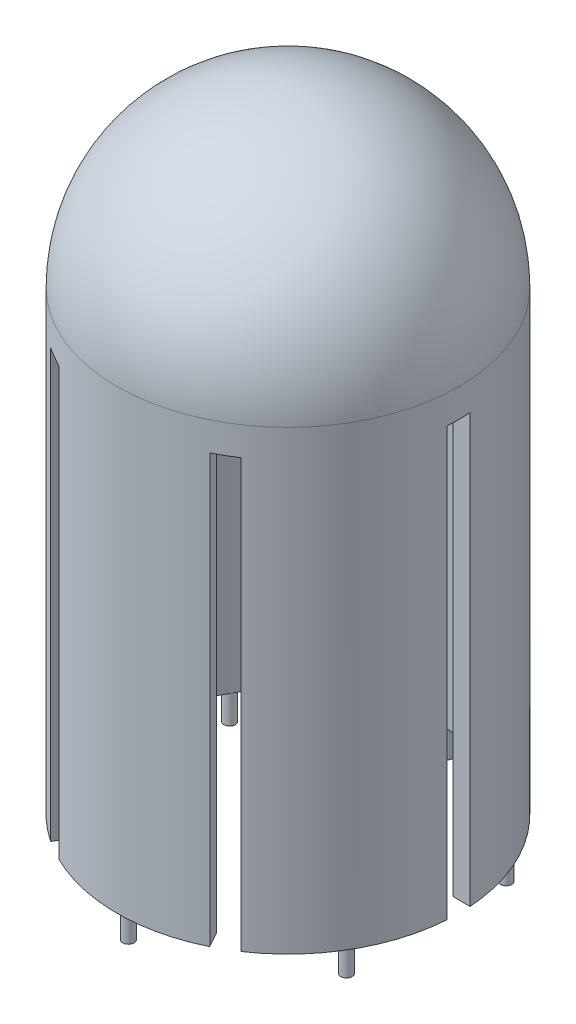
ISO-10303-21;
HEADER;
FILE_DESCRIPTION(('STEP AP214'),'2;1');
FILE_NAME('part.step','',(''),(''),'','','');
FILE_SCHEMA(('AUTOMOTIVE_DESIGN { 1 0 10303 214 1 1 1 1 }'));
ENDSEC;
DATA;
#1=APPLICATION_CONTEXT('core data for automotive mechanical design processes');
#2=APPLICATION_PROTOCOL_DEFINITION('international standard','automotive_design',2000,#1);
#3=PRODUCT_CONTEXT('',#1,'mechanical');
#4=PRODUCT('Part','Part','',(#3));
#5=PRODUCT_RELATED_PRODUCT_CATEGORY('part','',(#4));
#6=PRODUCT_DEFINITION_FORMATION('','',#4);
#7=PRODUCT_DEFINITION_CONTEXT('part definition',#1,'design');
#8=PRODUCT_DEFINITION('design','',#6,#7);
#9=PRODUCT_DEFINITION_SHAPE('','',#8);
#10=(LENGTH_UNIT() NAMED_UNIT(*) SI_UNIT(.MILLI.,.METRE.));
#11=(NAMED_UNIT(*) PLANE_ANGLE_UNIT() SI_UNIT($,.RADIAN.));
#12=(NAMED_UNIT(*) SI_UNIT($,.STERADIAN.) SOLID_ANGLE_UNIT());
#13=UNCERTAINTY_MEASURE_WITH_UNIT(LENGTH_MEASURE(1.E-05),#10,'distance_accuracy_value','');
#14=(GEOMETRIC_REPRESENTATION_CONTEXT(3) GLOBAL_UNCERTAINTY_ASSIGNED_CONTEXT((#13)) GLOBAL_UNIT_ASSIGNED_CONTEXT((#10,
#11,#12)) REPRESENTATION_CONTEXT('',''));
#15=CARTESIAN_POINT('',(0.,0.,0.));
#16=DIRECTION('',(0.,0.,1.));
#17=DIRECTION('',(1.,0.,0.));
#18=AXIS2_PLACEMENT_3D('',#15,#16,#17);
#19=CARTESIAN_POINT('',(0.,0.,0.));
#20=DIRECTION('',(0.,1.,0.));
#21=DIRECTION('',(0.,0.,1.));
#22=AXIS2_PLACEMENT_3D('',#19,#20,#21);
#23=PLANE('',#22);
#24=CARTESIAN_POINT('',(0.,0.,0.));
#25=DIRECTION('',(0.,1.,0.));
#26=DIRECTION('',(0.,0.,1.));
#27=AXIS2_PLACEMENT_3D('',#24,#25,#26);
#28=CIRCLE('',#27,38.1);
#29=CARTESIAN_POINT('',(-38.0170798767584,0.,2.51229728419531));
#30=VERTEX_POINT('',#29);
#31=CARTESIAN_POINT('',(-21.2306625511126,0.,31.6365132029557));
#32=VERTEX_POINT('',#31);
#33=EDGE_CURVE('E226',#30,#32,#28,.T.);
#34=ORIENTED_EDGE('',*,*,#33,.F.);
#35=DIRECTION('',(-0.999925339066658,0.,-0.0122195045901155));
#36=VECTOR('',#35,1.);
#37=CARTESIAN_POINT('',(-38.7268709437924,0.,2.503623341389));
#38=LINE('',#37,#36);
#39=CARTESIAN_POINT('',(-34.194379013763,0.,2.55901228272271));
#40=VERTEX_POINT('',#39);
#41=EDGE_CURVE('E213',#40,#30,#38,.T.);
#42=ORIENTED_EDGE('',*,*,#41,.F.);
#43=CARTESIAN_POINT('',(0.,0.,0.));
#44=DIRECTION('',(0.,-1.,0.));
#45=DIRECTION('',(0.,0.,-1.));
#46=AXIS2_PLACEMENT_3D('',#43,#44,#45);
#47=CIRCLE('',#46,34.29);
#48=CARTESIAN_POINT('',(-29.6960110957684,0.,17.1449999999999));
#49=VERTEX_POINT('',#48);
#50=EDGE_CURVE('E224',#49,#40,#47,.T.);
#51=ORIENTED_EDGE('',*,*,#50,.F.);
#52=CARTESIAN_POINT('',(-30.7958633585747,0.,17.7799999999999));
#53=DIRECTION('',(0.,1.,0.));
#54=DIRECTION('',(0.,0.,1.));
#55=AXIS2_PLACEMENT_3D('',#52,#53,#54);
#56=CIRCLE('',#55,1.27);
#57=EDGE_CURVE('E275',#49,#49,#56,.T.);
#58=ORIENTED_EDGE('',*,*,#57,.T.);
#59=CARTESIAN_POINT('',(-19.2821839260302,0.,28.354919908946));
#60=VERTEX_POINT('',#59);
#61=EDGE_CURVE('E233',#60,#49,#47,.T.);
#62=ORIENTED_EDGE('',*,*,#61,.F.);
#63=DIRECTION('',(0.51054507093003,0.,-0.859850993224437));
#64=VECTOR('',#63,1.);
#65=CARTESIAN_POINT('',(-21.5632771023254,0.,32.1966967567803));
#66=LINE('',#65,#64);
#67=EDGE_CURVE('E388',#32,#60,#66,.T.);
#68=ORIENTED_EDGE('',*,*,#67,.F.);
#69=EDGE_LOOP('',(#34,#42,#51,#58,#62,#68));
#70=FACE_BOUND('',#69,.T.);
#71=ADVANCED_FACE('F33',(#70),#23,.F.);
#72=CARTESIAN_POINT('',(-34.1971729264353,0.,-2.52140116591585));
#73=VERTEX_POINT('',#72);
#74=CARTESIAN_POINT('',(-29.6960110957683,0.,-17.1450000000001));
#75=VERTEX_POINT('',#74);
#76=EDGE_CURVE('E235',#73,#75,#47,.T.);
#77=ORIENTED_EDGE('',*,*,#76,.F.);
#78=DIRECTION('',(0.999925339066658,0.,0.012219504590117));
#79=VECTOR('',#78,1.);
#80=CARTESIAN_POINT('',(-38.6647958604746,0.,-2.57599738106963));
#81=LINE('',#80,#79);
#82=CARTESIAN_POINT('',(-38.0133553964775,0.,-2.56803650696334));
#83=VERTEX_POINT('',#82);
#84=EDGE_CURVE('E227',#83,#73,#81,.T.);
#85=ORIENTED_EDGE('',*,*,#84,.F.);
#86=CARTESIAN_POINT('',(-21.184253208347,0.,-31.6676083088799));
#87=VERTEX_POINT('',#86);
#88=EDGE_CURVE('E280',#87,#83,#28,.T.);
#89=ORIENTED_EDGE('',*,*,#88,.F.);
#90=DIRECTION('',(-0.489380268136629,0.,-0.872070497814552));
#91=VECTOR('',#90,1.);
#92=CARTESIAN_POINT('',(-21.5316368870428,0.,-32.2866423757138));
#93=LINE('',#92,#91);
#94=CARTESIAN_POINT('',(-19.3133591523119,0.,-28.3336947511935));
#95=VERTEX_POINT('',#94);
#96=EDGE_CURVE('E326',#95,#87,#93,.T.);
#97=ORIENTED_EDGE('',*,*,#96,.F.);
#98=EDGE_CURVE('E238',#75,#95,#47,.T.);
#99=ORIENTED_EDGE('',*,*,#98,.F.);
#100=CARTESIAN_POINT('',(-30.7958633585746,0.,-17.7800000000001));
#101=DIRECTION('',(0.,1.,0.));
#102=DIRECTION('',(0.,0.,1.));
#103=AXIS2_PLACEMENT_3D('',#100,#101,#102);
#104=CIRCLE('',#103,1.27);
#105=EDGE_CURVE('E414',#75,#75,#104,.T.);
#106=ORIENTED_EDGE('',*,*,#105,.T.);
#107=EDGE_LOOP('',(#77,#85,#89,#97,#99,#106));
#108=FACE_BOUND('',#107,.T.);
#109=ADVANCED_FACE('F440',(#108),#23,.F.);
#110=CARTESIAN_POINT('',(-14.9149890003986,0.,-30.8763210748624));
#111=VERTEX_POINT('',#110);
#112=CARTESIAN_POINT('',(2.39445790217862E-13,0.,-34.29));
#113=VERTEX_POINT('',#112);
#114=EDGE_CURVE('E241',#111,#113,#47,.T.);
#115=ORIENTED_EDGE('',*,*,#114,.F.);
#116=DIRECTION('',(0.489380268136628,0.,0.872070497814553));
#117=VECTOR('',#116,1.);
#118=CARTESIAN_POINT('',(-17.1015187581449,0.,-34.7726941378479));
#119=LINE('',#118,#117);
#120=CARTESIAN_POINT('',(-16.7826928453584,0.,-34.2045497099195));
#121=VERTEX_POINT('',#120);
#122=EDGE_CURVE('E321',#121,#111,#119,.T.);
#123=ORIENTED_EDGE('',*,*,#122,.F.);
#124=CARTESIAN_POINT('',(16.8328266684134,0.,-34.1799055930696));
#125=VERTEX_POINT('',#124);
#126=EDGE_CURVE('E287',#125,#121,#28,.T.);
#127=ORIENTED_EDGE('',*,*,#126,.F.);
#128=DIRECTION('',(0.510545070930029,0.,-0.859850993224437));
#129=VECTOR('',#128,1.);
#130=CARTESIAN_POINT('',(17.1952340567538,0.,-34.7902657171008));
#131=LINE('',#130,#129);
#132=CARTESIAN_POINT('',(14.8810198614533,0.,-30.8927070339107));
#133=VERTEX_POINT('',#132);
#134=EDGE_CURVE('E320',#133,#125,#131,.T.);
#135=ORIENTED_EDGE('',*,*,#134,.F.);
#136=EDGE_CURVE('E247',#113,#133,#47,.T.);
#137=ORIENTED_EDGE('',*,*,#136,.F.);
#138=CARTESIAN_POINT('',(2.48314152818524E-13,0.,-35.56));
#139=DIRECTION('',(0.,1.,0.));
#140=DIRECTION('',(0.,0.,1.));
#141=AXIS2_PLACEMENT_3D('',#138,#139,#140);
#142=CIRCLE('',#141,1.27);
#143=EDGE_CURVE('E408',#113,#113,#142,.T.);
#144=ORIENTED_EDGE('',*,*,#143,.T.);
#145=EDGE_LOOP('',(#115,#123,#127,#135,#137,#144));
#146=FACE_BOUND('',#145,.T.);
#147=ADVANCED_FACE('F319',(#146),#23,.F.);
#148=CARTESIAN_POINT('',(19.282183926038,0.,-28.3549199089407));
#149=VERTEX_POINT('',#148);
#150=CARTESIAN_POINT('',(29.6960110957686,0.,-17.1449999999997));
#151=VERTEX_POINT('',#150);
#152=EDGE_CURVE('E250',#149,#151,#47,.T.);
#153=ORIENTED_EDGE('',*,*,#152,.F.);
#154=DIRECTION('',(-0.51054507093003,0.,0.859850993224437));
#155=VECTOR('',#154,1.);
#156=CARTESIAN_POINT('',(21.5632771023339,0.,-32.1966967567762));
#157=LINE('',#156,#155);
#158=CARTESIAN_POINT('',(21.2306625511204,0.,-31.6365132029504));
#159=VERTEX_POINT('',#158);
#160=EDGE_CURVE('E344',#159,#149,#157,.T.);
#161=ORIENTED_EDGE('',*,*,#160,.F.);
#162=CARTESIAN_POINT('',(38.0170798767586,0.,-2.51229728419135));
#163=VERTEX_POINT('',#162);
#164=EDGE_CURVE('E298',#163,#159,#28,.T.);
#165=ORIENTED_EDGE('',*,*,#164,.F.);
#166=DIRECTION('',(0.999925339066659,0.,0.0122195045901146));
#167=VECTOR('',#166,1.);
#168=CARTESIAN_POINT('',(38.7268709438009,0.,-2.50362334138494));
#169=LINE('',#168,#167);
#170=CARTESIAN_POINT('',(34.1943790137633,0.,-2.55901228271875));
#171=VERTEX_POINT('',#170);
#172=EDGE_CURVE('E353',#171,#163,#169,.T.);
#173=ORIENTED_EDGE('',*,*,#172,.F.);
#174=EDGE_CURVE('E252',#151,#171,#47,.T.);
#175=ORIENTED_EDGE('',*,*,#174,.F.);
#176=CARTESIAN_POINT('',(30.7958633585748,0.,-17.7799999999997));
#177=DIRECTION('',(0.,1.,0.));
#178=DIRECTION('',(0.,0.,1.));
#179=AXIS2_PLACEMENT_3D('',#176,#177,#178);
#180=CIRCLE('',#179,1.27);
#181=EDGE_CURVE('E402',#151,#151,#180,.T.);
#182=ORIENTED_EDGE('',*,*,#181,.T.);
#183=EDGE_LOOP('',(#153,#161,#165,#173,#175,#182));
#184=FACE_BOUND('',#183,.T.);
#185=ADVANCED_FACE('F458',(#184),#23,.F.);
#186=CARTESIAN_POINT('',(34.197172926435,0.,2.5214011659198));
#187=VERTEX_POINT('',#186);
#188=CARTESIAN_POINT('',(29.6960110957682,0.,17.1450000000003));
#189=VERTEX_POINT('',#188);
#190=EDGE_CURVE('E255',#187,#189,#47,.T.);
#191=ORIENTED_EDGE('',*,*,#190,.F.);
#192=DIRECTION('',(-0.999925339066658,0.,-0.012219504590117));
#193=VECTOR('',#192,1.);
#194=CARTESIAN_POINT('',(38.6647958604831,0.,2.5759973810737));
#195=LINE('',#194,#193);
#196=CARTESIAN_POINT('',(38.0133553964772,0.,2.5680365069673));
#197=VERTEX_POINT('',#196);
#198=EDGE_CURVE('E358',#197,#187,#195,.T.);
#199=ORIENTED_EDGE('',*,*,#198,.F.);
#200=CARTESIAN_POINT('',(21.1842532083516,0.,31.6676083088768));
#201=VERTEX_POINT('',#200);
#202=EDGE_CURVE('E291',#201,#197,#28,.T.);
#203=ORIENTED_EDGE('',*,*,#202,.F.);
#204=DIRECTION('',(0.489380268136629,0.,0.872070497814552));
#205=VECTOR('',#204,1.);
#206=CARTESIAN_POINT('',(21.5316368870514,0.,32.2866423757179));
#207=LINE('',#206,#205);
#208=CARTESIAN_POINT('',(19.3133591523164,0.,28.3336947511904));
#209=VERTEX_POINT('',#208);
#210=EDGE_CURVE('E368',#209,#201,#207,.T.);
#211=ORIENTED_EDGE('',*,*,#210,.F.);
#212=EDGE_CURVE('E239',#189,#209,#47,.T.);
#213=ORIENTED_EDGE('',*,*,#212,.F.);
#214=CARTESIAN_POINT('',(30.7958633585744,0.,17.7800000000004));
#215=DIRECTION('',(0.,1.,0.));
#216=DIRECTION('',(0.,0.,1.));
#217=AXIS2_PLACEMENT_3D('',#214,#215,#216);
#218=CIRCLE('',#217,1.27);
#219=EDGE_CURVE('E398',#189,#189,#218,.T.);
#220=ORIENTED_EDGE('',*,*,#219,.T.);
#221=EDGE_LOOP('',(#191,#199,#203,#211,#213,#220));
#222=FACE_BOUND('',#221,.T.);
#223=ADVANCED_FACE('F450',(#222),#23,.F.);
#224=CARTESIAN_POINT('',(0.,101.6,0.));
#225=DIRECTION('',(0.,-1.,0.));
#226=DIRECTION('',(0.,0.,-1.));
#227=AXIS2_PLACEMENT_3D('',#224,#225,#226);
#228=CYLINDRICAL_SURFACE('',#227,38.1);
#229=CARTESIAN_POINT('',(0.,101.6,0.));
#230=DIRECTION('',(0.,1.,0.));
#231=DIRECTION('',(0.,0.,1.));
#232=AXIS2_PLACEMENT_3D('',#229,#230,#231);
#233=CIRCLE('',#232,38.1);
#234=CARTESIAN_POINT('',(0.,101.6,38.1));
#235=VERTEX_POINT('',#234);
#236=EDGE_CURVE('E290',#235,#235,#233,.T.);
#237=ORIENTED_EDGE('',*,*,#236,.F.);
#238=EDGE_LOOP('',(#237));
#239=FACE_BOUND('',#238,.T.);
#240=CARTESIAN_POINT('',(0.,95.25,0.));
#241=DIRECTION('',(0.,-1.,0.));
#242=DIRECTION('',(0.,0.,-1.));
#243=AXIS2_PLACEMENT_3D('',#240,#241,#242);
#244=CIRCLE('',#243,38.1);
#245=CARTESIAN_POINT('',(-38.0170798767584,95.25,2.51229728419531));
#246=VERTEX_POINT('',#245);
#247=CARTESIAN_POINT('',(-38.0133553964775,95.25,-2.56803650696334));
#248=VERTEX_POINT('',#247);
#249=EDGE_CURVE('E529',#246,#248,#244,.T.);
#250=ORIENTED_EDGE('',*,*,#249,.F.);
#251=DIRECTION('',(0.,-1.,0.));
#252=VECTOR('',#251,1.);
#253=CARTESIAN_POINT('',(-38.0170798767584,101.6,2.51229728419531));
#254=LINE('',#253,#252);
#255=EDGE_CURVE('E330',#246,#30,#254,.T.);
#256=ORIENTED_EDGE('',*,*,#255,.T.);
#257=ORIENTED_EDGE('',*,*,#33,.T.);
#258=DIRECTION('',(0.,-1.,0.));
#259=VECTOR('',#258,1.);
#260=CARTESIAN_POINT('',(-21.2306625511126,101.6,31.6365132029557));
#261=LINE('',#260,#259);
#262=CARTESIAN_POINT('',(-21.2306625511125,95.25,31.6365132029557));
#263=VERTEX_POINT('',#262);
#264=EDGE_CURVE('E394',#32,#263,#261,.F.);
#265=ORIENTED_EDGE('',*,*,#264,.T.);
#266=CARTESIAN_POINT('',(0.,95.25,0.));
#267=DIRECTION('',(0.,-1.,0.));
#268=DIRECTION('',(0.,0.,-1.));
#269=AXIS2_PLACEMENT_3D('',#266,#267,#268);
#270=CIRCLE('',#269,38.1);
#271=CARTESIAN_POINT('',(-16.8328266684049,95.25,34.1799055930738));
#272=VERTEX_POINT('',#271);
#273=EDGE_CURVE('E390',#272,#263,#270,.T.);
#274=ORIENTED_EDGE('',*,*,#273,.F.);
#275=DIRECTION('',(0.,-1.,0.));
#276=VECTOR('',#275,1.);
#277=CARTESIAN_POINT('',(-16.8328266684049,101.6,34.1799055930738));
#278=LINE('',#277,#276);
#279=CARTESIAN_POINT('',(-16.8328266684049,0.,34.1799055930738));
#280=VERTEX_POINT('',#279);
#281=EDGE_CURVE('E396',#272,#280,#278,.T.);
#282=ORIENTED_EDGE('',*,*,#281,.T.);
#283=CARTESIAN_POINT('',(16.7826928453633,0.,34.2045497099171));
#284=VERTEX_POINT('',#283);
#285=EDGE_CURVE('E282',#280,#284,#28,.T.);
#286=ORIENTED_EDGE('',*,*,#285,.T.);
#287=DIRECTION('',(0.,-1.,0.));
#288=VECTOR('',#287,1.);
#289=CARTESIAN_POINT('',(16.7826928453633,101.6,34.2045497099171));
#290=LINE('',#289,#288);
#291=CARTESIAN_POINT('',(16.7826928453633,95.25,34.2045497099171));
#292=VERTEX_POINT('',#291);
#293=EDGE_CURVE('E379',#284,#292,#290,.F.);
#294=ORIENTED_EDGE('',*,*,#293,.T.);
#295=CARTESIAN_POINT('',(0.,95.25,0.));
#296=DIRECTION('',(0.,-1.,0.));
#297=DIRECTION('',(0.,0.,-1.));
#298=AXIS2_PLACEMENT_3D('',#295,#296,#297);
#299=CIRCLE('',#298,38.1);
#300=CARTESIAN_POINT('',(21.1842532083516,95.25,31.6676083088768));
#301=VERTEX_POINT('',#300);
#302=EDGE_CURVE('E375',#301,#292,#299,.T.);
#303=ORIENTED_EDGE('',*,*,#302,.F.);
#304=DIRECTION('',(0.,-1.,0.));
#305=VECTOR('',#304,1.);
#306=CARTESIAN_POINT('',(21.1842532083516,101.6,31.6676083088768));
#307=LINE('',#306,#305);
#308=EDGE_CURVE('E381',#301,#201,#307,.T.);
#309=ORIENTED_EDGE('',*,*,#308,.T.);
#310=ORIENTED_EDGE('',*,*,#202,.T.);
#311=DIRECTION('',(0.,-1.,0.));
#312=VECTOR('',#311,1.);
#313=CARTESIAN_POINT('',(38.0133553964772,101.6,2.5680365069673));
#314=LINE('',#313,#312);
#315=CARTESIAN_POINT('',(38.0133553964772,95.25,2.5680365069673));
#316=VERTEX_POINT('',#315);
#317=EDGE_CURVE('E364',#197,#316,#314,.F.);
#318=ORIENTED_EDGE('',*,*,#317,.T.);
#319=CARTESIAN_POINT('',(0.,95.25,0.));
#320=DIRECTION('',(0.,-1.,0.));
#321=DIRECTION('',(0.,0.,-1.));
#322=AXIS2_PLACEMENT_3D('',#319,#320,#321);
#323=CIRCLE('',#322,38.1);
#324=CARTESIAN_POINT('',(38.0170798767586,95.25,-2.51229728419135));
#325=VERTEX_POINT('',#324);
#326=EDGE_CURVE('E360',#325,#316,#323,.T.);
#327=ORIENTED_EDGE('',*,*,#326,.F.);
#328=DIRECTION('',(0.,-1.,0.));
#329=VECTOR('',#328,1.);
#330=CARTESIAN_POINT('',(38.0170798767586,101.6,-2.51229728419135));
#331=LINE('',#330,#329);
#332=EDGE_CURVE('E366',#325,#163,#331,.T.);
#333=ORIENTED_EDGE('',*,*,#332,.T.);
#334=ORIENTED_EDGE('',*,*,#164,.T.);
#335=DIRECTION('',(0.,-1.,0.));
#336=VECTOR('',#335,1.);
#337=CARTESIAN_POINT('',(21.2306625511204,101.6,-31.6365132029504));
#338=LINE('',#337,#336);
#339=CARTESIAN_POINT('',(21.2306625511204,95.25,-31.6365132029504));
#340=VERTEX_POINT('',#339);
#341=EDGE_CURVE('E350',#159,#340,#338,.F.);
#342=ORIENTED_EDGE('',*,*,#341,.T.);
#343=CARTESIAN_POINT('',(0.,95.25,0.));
#344=DIRECTION('',(0.,-1.,0.));
#345=DIRECTION('',(0.,0.,-1.));
#346=AXIS2_PLACEMENT_3D('',#343,#344,#345);
#347=CIRCLE('',#346,38.1);
#348=CARTESIAN_POINT('',(16.8328266684134,95.25,-34.1799055930696));
#349=VERTEX_POINT('',#348);
#350=EDGE_CURVE('E346',#349,#340,#347,.T.);
#351=ORIENTED_EDGE('',*,*,#350,.F.);
#352=DIRECTION('',(0.,-1.,0.));
#353=VECTOR('',#352,1.);
#354=CARTESIAN_POINT('',(16.8328266684134,101.6,-34.1799055930696));
#355=LINE('',#354,#353);
#356=EDGE_CURVE('E314',#349,#125,#355,.T.);
#357=ORIENTED_EDGE('',*,*,#356,.T.);
#358=ORIENTED_EDGE('',*,*,#126,.T.);
#359=DIRECTION('',(0.,-1.,0.));
#360=VECTOR('',#359,1.);
#361=CARTESIAN_POINT('',(-16.7826928453584,101.6,-34.2045497099195));
#362=LINE('',#361,#360);
#363=CARTESIAN_POINT('',(-16.7826928453584,95.25,-34.2045497099195));
#364=VERTEX_POINT('',#363);
#365=EDGE_CURVE('E312',#121,#364,#362,.F.);
#366=ORIENTED_EDGE('',*,*,#365,.T.);
#367=CARTESIAN_POINT('',(0.,95.25,0.));
#368=DIRECTION('',(0.,-1.,0.));
#369=DIRECTION('',(0.,0.,-1.));
#370=AXIS2_PLACEMENT_3D('',#367,#368,#369);
#371=CIRCLE('',#370,38.1);
#372=CARTESIAN_POINT('',(-21.184253208347,95.25,-31.6676083088799));
#373=VERTEX_POINT('',#372);
#374=EDGE_CURVE('E334',#373,#364,#371,.T.);
#375=ORIENTED_EDGE('',*,*,#374,.F.);
#376=DIRECTION('',(0.,-1.,0.));
#377=VECTOR('',#376,1.);
#378=CARTESIAN_POINT('',(-21.184253208347,101.6,-31.6676083088799));
#379=LINE('',#378,#377);
#380=EDGE_CURVE('E337',#373,#87,#379,.T.);
#381=ORIENTED_EDGE('',*,*,#380,.T.);
#382=ORIENTED_EDGE('',*,*,#88,.T.);
#383=DIRECTION('',(0.,-1.,0.));
#384=VECTOR('',#383,1.);
#385=CARTESIAN_POINT('',(-38.0133553964775,101.6,-2.56803650696334));
#386=LINE('',#385,#384);
#387=EDGE_CURVE('E527',#83,#248,#386,.F.);
#388=ORIENTED_EDGE('',*,*,#387,.T.);
#389=EDGE_LOOP('',(#250,#256,#257,#265,#274,#282,#286,#294,#303,#309,#310,#318,#327,#333,#334,
#342,#351,#357,#358,#366,#375,#381,#382,#388));
#390=FACE_BOUND('',#389,.T.);
#391=ADVANCED_FACE('F35',(#239,#390),#228,.T.);
#392=CARTESIAN_POINT('',(14.9149890004035,0.,30.87632107486));
#393=VERTEX_POINT('',#392);
#394=CARTESIAN_POINT('',(0.,0.,34.29));
#395=VERTEX_POINT('',#394);
#396=EDGE_CURVE('E240',#393,#395,#47,.T.);
#397=ORIENTED_EDGE('',*,*,#396,.F.);
#398=DIRECTION('',(-0.489380268136628,0.,-0.872070497814553));
#399=VECTOR('',#398,1.);
#400=CARTESIAN_POINT('',(17.1015187581535,0.,34.772694137852));
#401=LINE('',#400,#399);
#402=EDGE_CURVE('E373',#284,#393,#401,.T.);
#403=ORIENTED_EDGE('',*,*,#402,.F.);
#404=ORIENTED_EDGE('',*,*,#285,.F.);
#405=DIRECTION('',(-0.510545070930029,0.,0.859850993224437));
#406=VECTOR('',#405,1.);
#407=CARTESIAN_POINT('',(-17.1952340567452,0.,34.7902657171049));
#408=LINE('',#407,#406);
#409=CARTESIAN_POINT('',(-14.8810198614447,0.,30.8927070339148));
#410=VERTEX_POINT('',#409);
#411=EDGE_CURVE('E383',#410,#280,#408,.T.);
#412=ORIENTED_EDGE('',*,*,#411,.F.);
#413=EDGE_CURVE('E237',#395,#410,#47,.T.);
#414=ORIENTED_EDGE('',*,*,#413,.F.);
#415=CARTESIAN_POINT('',(0.,0.,35.56));
#416=DIRECTION('',(0.,1.,0.));
#417=DIRECTION('',(0.,0.,1.));
#418=AXIS2_PLACEMENT_3D('',#415,#416,#417);
#419=CIRCLE('',#418,1.27);
#420=EDGE_CURVE('E267',#395,#395,#419,.T.);
#421=ORIENTED_EDGE('',*,*,#420,.T.);
#422=EDGE_LOOP('',(#397,#403,#404,#412,#414,#421));
#423=FACE_BOUND('',#422,.T.);
#424=ADVANCED_FACE('F441',(#423),#23,.F.);
#425=CARTESIAN_POINT('',(0.,101.6,0.));
#426=DIRECTION('',(0.,-1.,0.));
#427=DIRECTION('',(0.,0.,-1.));
#428=AXIS2_PLACEMENT_3D('',#425,#426,#427);
#429=SPHERICAL_SURFACE('',#428,38.1);
#430=ORIENTED_EDGE('',*,*,#236,.T.);
#431=EDGE_LOOP('',(#430));
#432=FACE_BOUND('',#431,.T.);
#433=ADVANCED_FACE('F448',(#432),#429,.T.);
#434=CARTESIAN_POINT('',(0.,101.6,0.));
#435=DIRECTION('',(0.,-1.,0.));
#436=DIRECTION('',(0.,0.,-1.));
#437=AXIS2_PLACEMENT_3D('',#434,#435,#436);
#438=CYLINDRICAL_SURFACE('',#437,34.29);
#439=ORIENTED_EDGE('',*,*,#50,.T.);
#440=DIRECTION('',(0.,-1.,0.));
#441=VECTOR('',#440,1.);
#442=CARTESIAN_POINT('',(-34.194379013763,101.6,2.55901228272271));
#443=LINE('',#442,#441);
#444=CARTESIAN_POINT('',(-34.194379013763,95.25,2.55901228272271));
#445=VERTEX_POINT('',#444);
#446=EDGE_CURVE('E11',#40,#445,#443,.F.);
#447=ORIENTED_EDGE('',*,*,#446,.T.);
#448=CARTESIAN_POINT('',(0.,95.25,0.));
#449=DIRECTION('',(0.,-1.,0.));
#450=DIRECTION('',(0.,0.,-1.));
#451=AXIS2_PLACEMENT_3D('',#448,#449,#450);
#452=CIRCLE('',#451,34.29);
#453=CARTESIAN_POINT('',(-34.1971729264353,95.25,-2.52140116591585));
#454=VERTEX_POINT('',#453);
#455=EDGE_CURVE('E534',#454,#445,#452,.F.);
#456=ORIENTED_EDGE('',*,*,#455,.F.);
#457=DIRECTION('',(0.,-1.,0.));
#458=VECTOR('',#457,1.);
#459=CARTESIAN_POINT('',(-34.1971729264353,101.6,-2.52140116591585));
#460=LINE('',#459,#458);
#461=EDGE_CURVE('E41',#454,#73,#460,.T.);
#462=ORIENTED_EDGE('',*,*,#461,.T.);
#463=ORIENTED_EDGE('',*,*,#76,.T.);
#464=ORIENTED_EDGE('',*,*,#98,.T.);
#465=DIRECTION('',(0.,-1.,0.));
#466=VECTOR('',#465,1.);
#467=CARTESIAN_POINT('',(-19.3133591523119,101.6,-28.3336947511935));
#468=LINE('',#467,#466);
#469=CARTESIAN_POINT('',(-19.3133591523119,95.25,-28.3336947511935));
#470=VERTEX_POINT('',#469);
#471=EDGE_CURVE('E519',#95,#470,#468,.F.);
#472=ORIENTED_EDGE('',*,*,#471,.T.);
#473=CARTESIAN_POINT('',(0.,95.25,0.));
#474=DIRECTION('',(0.,-1.,0.));
#475=DIRECTION('',(0.,0.,-1.));
#476=AXIS2_PLACEMENT_3D('',#473,#474,#475);
#477=CIRCLE('',#476,34.29);
#478=CARTESIAN_POINT('',(-14.9149890003986,95.25,-30.8763210748624));
#479=VERTEX_POINT('',#478);
#480=EDGE_CURVE('E542',#479,#470,#477,.F.);
#481=ORIENTED_EDGE('',*,*,#480,.F.);
#482=DIRECTION('',(0.,-1.,0.));
#483=VECTOR('',#482,1.);
#484=CARTESIAN_POINT('',(-14.9149890003986,101.6,-30.8763210748624));
#485=LINE('',#484,#483);
#486=EDGE_CURVE('E523',#479,#111,#485,.T.);
#487=ORIENTED_EDGE('',*,*,#486,.T.);
#488=ORIENTED_EDGE('',*,*,#114,.T.);
#489=ORIENTED_EDGE('',*,*,#136,.T.);
#490=DIRECTION('',(0.,-1.,0.));
#491=VECTOR('',#490,1.);
#492=CARTESIAN_POINT('',(14.8810198614533,101.6,-30.8927070339107));
#493=LINE('',#492,#491);
#494=CARTESIAN_POINT('',(14.8810198614533,95.25,-30.8927070339107));
#495=VERTEX_POINT('',#494);
#496=EDGE_CURVE('E544',#133,#495,#493,.F.);
#497=ORIENTED_EDGE('',*,*,#496,.T.);
#498=CARTESIAN_POINT('',(0.,95.25,0.));
#499=DIRECTION('',(0.,-1.,0.));
#500=DIRECTION('',(0.,0.,-1.));
#501=AXIS2_PLACEMENT_3D('',#498,#499,#500);
#502=CIRCLE('',#501,34.29);
#503=CARTESIAN_POINT('',(19.282183926038,95.25,-28.3549199089407));
#504=VERTEX_POINT('',#503);
#505=EDGE_CURVE('E549',#504,#495,#502,.F.);
#506=ORIENTED_EDGE('',*,*,#505,.F.);
#507=DIRECTION('',(0.,-1.,0.));
#508=VECTOR('',#507,1.);
#509=CARTESIAN_POINT('',(19.282183926038,101.6,-28.3549199089407));
#510=LINE('',#509,#508);
#511=EDGE_CURVE('E546',#504,#149,#510,.T.);
#512=ORIENTED_EDGE('',*,*,#511,.T.);
#513=ORIENTED_EDGE('',*,*,#152,.T.);
#514=ORIENTED_EDGE('',*,*,#174,.T.);
#515=DIRECTION('',(0.,-1.,0.));
#516=VECTOR('',#515,1.);
#517=CARTESIAN_POINT('',(34.1943790137633,101.6,-2.55901228271875));
#518=LINE('',#517,#516);
#519=CARTESIAN_POINT('',(34.1943790137633,95.25,-2.55901228271875));
#520=VERTEX_POINT('',#519);
#521=EDGE_CURVE('E551',#171,#520,#518,.F.);
#522=ORIENTED_EDGE('',*,*,#521,.T.);
#523=CARTESIAN_POINT('',(0.,95.25,0.));
#524=DIRECTION('',(0.,-1.,0.));
#525=DIRECTION('',(0.,0.,-1.));
#526=AXIS2_PLACEMENT_3D('',#523,#524,#525);
#527=CIRCLE('',#526,34.29);
#528=CARTESIAN_POINT('',(34.197172926435,95.25,2.5214011659198));
#529=VERTEX_POINT('',#528);
#530=EDGE_CURVE('E554',#529,#520,#527,.F.);
#531=ORIENTED_EDGE('',*,*,#530,.F.);
#532=DIRECTION('',(0.,-1.,0.));
#533=VECTOR('',#532,1.);
#534=CARTESIAN_POINT('',(34.197172926435,101.6,2.5214011659198));
#535=LINE('',#534,#533);
#536=EDGE_CURVE('E470',#529,#187,#535,.T.);
#537=ORIENTED_EDGE('',*,*,#536,.T.);
#538=ORIENTED_EDGE('',*,*,#190,.T.);
#539=ORIENTED_EDGE('',*,*,#212,.T.);
#540=DIRECTION('',(0.,-1.,0.));
#541=VECTOR('',#540,1.);
#542=CARTESIAN_POINT('',(19.3133591523164,101.6,28.3336947511904));
#543=LINE('',#542,#541);
#544=CARTESIAN_POINT('',(19.3133591523164,95.25,28.3336947511904));
#545=VERTEX_POINT('',#544);
#546=EDGE_CURVE('E556',#209,#545,#543,.F.);
#547=ORIENTED_EDGE('',*,*,#546,.T.);
#548=CARTESIAN_POINT('',(0.,95.25,0.));
#549=DIRECTION('',(0.,-1.,0.));
#550=DIRECTION('',(0.,0.,-1.));
#551=AXIS2_PLACEMENT_3D('',#548,#549,#550);
#552=CIRCLE('',#551,34.29);
#553=CARTESIAN_POINT('',(14.9149890004035,95.25,30.87632107486));
#554=VERTEX_POINT('',#553);
#555=EDGE_CURVE('E560',#554,#545,#552,.F.);
#556=ORIENTED_EDGE('',*,*,#555,.F.);
#557=DIRECTION('',(0.,-1.,0.));
#558=VECTOR('',#557,1.);
#559=CARTESIAN_POINT('',(14.9149890004035,101.6,30.87632107486));
#560=LINE('',#559,#558);
#561=EDGE_CURVE('E558',#554,#393,#560,.T.);
#562=ORIENTED_EDGE('',*,*,#561,.T.);
#563=ORIENTED_EDGE('',*,*,#396,.T.);
#564=ORIENTED_EDGE('',*,*,#413,.T.);
#565=DIRECTION('',(0.,-1.,0.));
#566=VECTOR('',#565,1.);
#567=CARTESIAN_POINT('',(-14.8810198614447,101.6,30.8927070339148));
#568=LINE('',#567,#566);
#569=CARTESIAN_POINT('',(-14.8810198614447,95.25,30.8927070339148));
#570=VERTEX_POINT('',#569);
#571=EDGE_CURVE('E562',#410,#570,#568,.F.);
#572=ORIENTED_EDGE('',*,*,#571,.T.);
#573=CARTESIAN_POINT('',(0.,95.25,0.));
#574=DIRECTION('',(0.,-1.,0.));
#575=DIRECTION('',(0.,0.,-1.));
#576=AXIS2_PLACEMENT_3D('',#573,#574,#575);
#577=CIRCLE('',#576,34.29);
#578=CARTESIAN_POINT('',(-19.2821839260302,95.25,28.354919908946));
#579=VERTEX_POINT('',#578);
#580=EDGE_CURVE('E296',#579,#570,#577,.F.);
#581=ORIENTED_EDGE('',*,*,#580,.F.);
#582=DIRECTION('',(0.,-1.,0.));
#583=VECTOR('',#582,1.);
#584=CARTESIAN_POINT('',(-19.2821839260302,101.6,28.354919908946));
#585=LINE('',#584,#583);
#586=EDGE_CURVE('E565',#579,#60,#585,.T.);
#587=ORIENTED_EDGE('',*,*,#586,.T.);
#588=ORIENTED_EDGE('',*,*,#61,.T.);
#589=EDGE_LOOP('',(#439,#447,#456,#462,#463,#464,#472,#481,#487,#488,#489,#497,#506,#512,#513,
#514,#522,#531,#537,#538,#539,#547,#556,#562,#563,#564,#572,#581,#587,#588));
#590=FACE_BOUND('',#589,.T.);
#591=CARTESIAN_POINT('',(0.,101.6,0.));
#592=DIRECTION('',(0.,-1.,0.));
#593=DIRECTION('',(0.,0.,-1.));
#594=AXIS2_PLACEMENT_3D('',#591,#592,#593);
#595=CIRCLE('',#594,34.29);
#596=CARTESIAN_POINT('',(0.,101.6,-34.29));
#597=VERTEX_POINT('',#596);
#598=EDGE_CURVE('E245',#597,#597,#595,.T.);
#599=ORIENTED_EDGE('',*,*,#598,.F.);
#600=EDGE_LOOP('',(#599));
#601=FACE_BOUND('',#600,.T.);
#602=ADVANCED_FACE('F229',(#590,#601),#438,.F.);
#603=CARTESIAN_POINT('',(0.,101.6,0.));
#604=DIRECTION('',(0.,-1.,0.));
#605=DIRECTION('',(0.,0.,1.));
#606=AXIS2_PLACEMENT_3D('',#603,#604,#605);
#607=SPHERICAL_SURFACE('',#606,34.2899999999999);
#608=ORIENTED_EDGE('',*,*,#598,.T.);
#609=EDGE_LOOP('',(#608));
#610=FACE_BOUND('',#609,.T.);
#611=ADVANCED_FACE('F715',(#610),#607,.F.);
#612=CARTESIAN_POINT('',(0.,-6.35,35.56));
#613=DIRECTION('',(0.,1.,0.));
#614=DIRECTION('',(0.,0.,1.));
#615=AXIS2_PLACEMENT_3D('',#612,#613,#614);
#616=CYLINDRICAL_SURFACE('',#615,1.27);
#617=CARTESIAN_POINT('',(0.,-6.35,35.56));
#618=DIRECTION('',(0.,1.,0.));
#619=DIRECTION('',(0.,0.,1.));
#620=AXIS2_PLACEMENT_3D('',#617,#618,#619);
#621=CIRCLE('',#620,1.27);
#622=CARTESIAN_POINT('',(0.,-6.35,36.83));
#623=VERTEX_POINT('',#622);
#624=EDGE_CURVE('E262',#623,#623,#621,.T.);
#625=ORIENTED_EDGE('',*,*,#624,.T.);
#626=EDGE_LOOP('',(#625));
#627=FACE_BOUND('',#626,.T.);
#628=ORIENTED_EDGE('',*,*,#420,.F.);
#629=EDGE_LOOP('',(#628));
#630=FACE_BOUND('',#629,.T.);
#631=ADVANCED_FACE('F436',(#627,#630),#616,.T.);
#632=CARTESIAN_POINT('',(0.,-6.35,35.56));
#633=DIRECTION('',(0.,1.,0.));
#634=DIRECTION('',(0.,0.,1.));
#635=AXIS2_PLACEMENT_3D('',#632,#633,#634);
#636=PLANE('',#635);
#637=ORIENTED_EDGE('',*,*,#624,.F.);
#638=EDGE_LOOP('',(#637));
#639=FACE_BOUND('',#638,.T.);
#640=ADVANCED_FACE('F427',(#639),#636,.F.);
#641=CARTESIAN_POINT('',(-30.7958633585747,-6.35,17.7799999999999));
#642=DIRECTION('',(0.,1.,0.));
#643=DIRECTION('',(0.,0.,1.));
#644=AXIS2_PLACEMENT_3D('',#641,#642,#643);
#645=CYLINDRICAL_SURFACE('',#644,1.27);
#646=CARTESIAN_POINT('',(-30.7958633585747,-6.35,17.7799999999999));
#647=DIRECTION('',(0.,1.,0.));
#648=DIRECTION('',(0.,0.,1.));
#649=AXIS2_PLACEMENT_3D('',#646,#647,#648);
#650=CIRCLE('',#649,1.27);
#651=CARTESIAN_POINT('',(-30.7958633585747,-6.35,19.0499999999999));
#652=VERTEX_POINT('',#651);
#653=EDGE_CURVE('E272',#652,#652,#650,.T.);
#654=ORIENTED_EDGE('',*,*,#653,.T.);
#655=EDGE_LOOP('',(#654));
#656=FACE_BOUND('',#655,.T.);
#657=ORIENTED_EDGE('',*,*,#57,.F.);
#658=EDGE_LOOP('',(#657));
#659=FACE_BOUND('',#658,.T.);
#660=ADVANCED_FACE('F424',(#656,#659),#645,.T.);
#661=CARTESIAN_POINT('',(-30.7958633585747,-6.35,17.7799999999999));
#662=DIRECTION('',(0.,1.,0.));
#663=DIRECTION('',(0.,0.,1.));
#664=AXIS2_PLACEMENT_3D('',#661,#662,#663);
#665=PLANE('',#664);
#666=ORIENTED_EDGE('',*,*,#653,.F.);
#667=EDGE_LOOP('',(#666));
#668=FACE_BOUND('',#667,.T.);
#669=ADVANCED_FACE('F426',(#668),#665,.F.);
#670=CARTESIAN_POINT('',(-30.7958633585746,-6.35,-17.7800000000001));
#671=DIRECTION('',(0.,1.,0.));
#672=DIRECTION('',(0.,0.,1.));
#673=AXIS2_PLACEMENT_3D('',#670,#671,#672);
#674=CYLINDRICAL_SURFACE('',#673,1.27);
#675=CARTESIAN_POINT('',(-30.7958633585746,-6.35,-17.7800000000001));
#676=DIRECTION('',(0.,1.,0.));
#677=DIRECTION('',(0.,0.,1.));
#678=AXIS2_PLACEMENT_3D('',#675,#676,#677);
#679=CIRCLE('',#678,1.27);
#680=CARTESIAN_POINT('',(-30.7958633585746,-6.35,-16.5100000000001));
#681=VERTEX_POINT('',#680);
#682=EDGE_CURVE('E416',#681,#681,#679,.T.);
#683=ORIENTED_EDGE('',*,*,#682,.T.);
#684=EDGE_LOOP('',(#683));
#685=FACE_BOUND('',#684,.T.);
#686=ORIENTED_EDGE('',*,*,#105,.F.);
#687=EDGE_LOOP('',(#686));
#688=FACE_BOUND('',#687,.T.);
#689=ADVANCED_FACE('F433',(#685,#688),#674,.T.);
#690=CARTESIAN_POINT('',(-30.7958633585746,-6.35,-17.7800000000001));
#691=DIRECTION('',(0.,1.,0.));
#692=DIRECTION('',(0.,0.,1.));
#693=AXIS2_PLACEMENT_3D('',#690,#691,#692);
#694=PLANE('',#693);
#695=ORIENTED_EDGE('',*,*,#682,.F.);
#696=EDGE_LOOP('',(#695));
#697=FACE_BOUND('',#696,.T.);
#698=ADVANCED_FACE('F500',(#697),#694,.F.);
#699=CARTESIAN_POINT('',(2.48314152818524E-13,-6.35,-35.56));
#700=DIRECTION('',(0.,1.,0.));
#701=DIRECTION('',(0.,0.,1.));
#702=AXIS2_PLACEMENT_3D('',#699,#700,#701);
#703=CYLINDRICAL_SURFACE('',#702,1.27);
#704=CARTESIAN_POINT('',(2.48314152818524E-13,-6.35,-35.56));
#705=DIRECTION('',(0.,1.,0.));
#706=DIRECTION('',(0.,0.,1.));
#707=AXIS2_PLACEMENT_3D('',#704,#705,#706);
#708=CIRCLE('',#707,1.27);
#709=CARTESIAN_POINT('',(2.48314152818524E-13,-6.35,-34.29));
#710=VERTEX_POINT('',#709);
#711=EDGE_CURVE('E411',#710,#710,#708,.T.);
#712=ORIENTED_EDGE('',*,*,#711,.T.);
#713=EDGE_LOOP('',(#712));
#714=FACE_BOUND('',#713,.T.);
#715=ORIENTED_EDGE('',*,*,#143,.F.);
#716=EDGE_LOOP('',(#715));
#717=FACE_BOUND('',#716,.T.);
#718=ADVANCED_FACE('F496',(#714,#717),#703,.T.);
#719=CARTESIAN_POINT('',(2.48314152818524E-13,-6.35,-35.56));
#720=DIRECTION('',(0.,1.,0.));
#721=DIRECTION('',(0.,0.,1.));
#722=AXIS2_PLACEMENT_3D('',#719,#720,#721);
#723=PLANE('',#722);
#724=ORIENTED_EDGE('',*,*,#711,.F.);
#725=EDGE_LOOP('',(#724));
#726=FACE_BOUND('',#725,.T.);
#727=ADVANCED_FACE('F492',(#726),#723,.F.);
#728=CARTESIAN_POINT('',(30.7958633585748,-6.35,-17.7799999999997));
#729=DIRECTION('',(0.,1.,0.));
#730=DIRECTION('',(0.,0.,1.));
#731=AXIS2_PLACEMENT_3D('',#728,#729,#730);
#732=CYLINDRICAL_SURFACE('',#731,1.27);
#733=CARTESIAN_POINT('',(30.7958633585748,-6.35,-17.7799999999997));
#734=DIRECTION('',(0.,1.,0.));
#735=DIRECTION('',(0.,0.,1.));
#736=AXIS2_PLACEMENT_3D('',#733,#734,#735);
#737=CIRCLE('',#736,1.27);
#738=CARTESIAN_POINT('',(30.7958633585748,-6.35,-16.5099999999997));
#739=VERTEX_POINT('',#738);
#740=EDGE_CURVE('E405',#739,#739,#737,.T.);
#741=ORIENTED_EDGE('',*,*,#740,.T.);
#742=EDGE_LOOP('',(#741));
#743=FACE_BOUND('',#742,.T.);
#744=ORIENTED_EDGE('',*,*,#181,.F.);
#745=EDGE_LOOP('',(#744));
#746=FACE_BOUND('',#745,.T.);
#747=ADVANCED_FACE('F485',(#743,#746),#732,.T.);
#748=CARTESIAN_POINT('',(30.7958633585748,-6.35,-17.7799999999997));
#749=DIRECTION('',(0.,1.,0.));
#750=DIRECTION('',(0.,0.,1.));
#751=AXIS2_PLACEMENT_3D('',#748,#749,#750);
#752=PLANE('',#751);
#753=ORIENTED_EDGE('',*,*,#740,.F.);
#754=EDGE_LOOP('',(#753));
#755=FACE_BOUND('',#754,.T.);
#756=ADVANCED_FACE('F475',(#755),#752,.F.);
#757=CARTESIAN_POINT('',(30.7958633585744,-6.35,17.7800000000004));
#758=DIRECTION('',(0.,1.,0.));
#759=DIRECTION('',(0.,0.,1.));
#760=AXIS2_PLACEMENT_3D('',#757,#758,#759);
#761=CYLINDRICAL_SURFACE('',#760,1.27);
#762=CARTESIAN_POINT('',(30.7958633585744,-6.35,17.7800000000004));
#763=DIRECTION('',(0.,1.,0.));
#764=DIRECTION('',(0.,0.,1.));
#765=AXIS2_PLACEMENT_3D('',#762,#763,#764);
#766=CIRCLE('',#765,1.27);
#767=CARTESIAN_POINT('',(30.7958633585744,-6.35,19.0500000000004));
#768=VERTEX_POINT('',#767);
#769=EDGE_CURVE('E399',#768,#768,#766,.T.);
#770=ORIENTED_EDGE('',*,*,#769,.T.);
#771=EDGE_LOOP('',(#770));
#772=FACE_BOUND('',#771,.T.);
#773=ORIENTED_EDGE('',*,*,#219,.F.);
#774=EDGE_LOOP('',(#773));
#775=FACE_BOUND('',#774,.T.);
#776=ADVANCED_FACE('F472',(#772,#775),#761,.T.);
#777=CARTESIAN_POINT('',(30.7958633585744,-6.35,17.7800000000004));
#778=DIRECTION('',(0.,1.,0.));
#779=DIRECTION('',(0.,0.,1.));
#780=AXIS2_PLACEMENT_3D('',#777,#778,#779);
#781=PLANE('',#780);
#782=ORIENTED_EDGE('',*,*,#769,.F.);
#783=EDGE_LOOP('',(#782));
#784=FACE_BOUND('',#783,.T.);
#785=ADVANCED_FACE('F474',(#784),#781,.F.);
#786=CARTESIAN_POINT('',(-17.1952340567452,95.25,34.7902657171049));
#787=DIRECTION('',(0.859850993224437,0.,0.510545070930029));
#788=DIRECTION('',(0.510545070930029,0.,-0.859850993224437));
#789=AXIS2_PLACEMENT_3D('',#786,#787,#788);
#790=PLANE('',#789);
#791=DIRECTION('',(-0.510545070930029,0.,0.859850993224437));
#792=VECTOR('',#791,1.);
#793=CARTESIAN_POINT('',(-17.1952340567452,95.25,34.7902657171049));
#794=LINE('',#793,#792);
#795=EDGE_CURVE('E384',#570,#272,#794,.T.);
#796=ORIENTED_EDGE('',*,*,#795,.F.);
#797=ORIENTED_EDGE('',*,*,#571,.F.);
#798=ORIENTED_EDGE('',*,*,#411,.T.);
#799=ORIENTED_EDGE('',*,*,#281,.F.);
#800=EDGE_LOOP('',(#796,#797,#798,#799));
#801=FACE_BOUND('',#800,.T.);
#802=ADVANCED_FACE('F482',(#801),#790,.F.);
#803=CARTESIAN_POINT('',(-21.5632771023254,95.25,32.1966967567803));
#804=DIRECTION('',(-0.859850993224437,0.,-0.51054507093003));
#805=DIRECTION('',(-0.51054507093003,0.,0.859850993224437));
#806=AXIS2_PLACEMENT_3D('',#803,#804,#805);
#807=PLANE('',#806);
#808=ORIENTED_EDGE('',*,*,#67,.T.);
#809=ORIENTED_EDGE('',*,*,#586,.F.);
#810=DIRECTION('',(0.51054507093003,0.,-0.859850993224437));
#811=VECTOR('',#810,1.);
#812=CARTESIAN_POINT('',(-21.5632771023254,95.25,32.1966967567803));
#813=LINE('',#812,#811);
#814=EDGE_CURVE('E387',#263,#579,#813,.T.);
#815=ORIENTED_EDGE('',*,*,#814,.F.);
#816=ORIENTED_EDGE('',*,*,#264,.F.);
#817=EDGE_LOOP('',(#808,#809,#815,#816));
#818=FACE_BOUND('',#817,.T.);
#819=ADVANCED_FACE('F578',(#818),#807,.F.);
#820=CARTESIAN_POINT('',(0.,95.25,0.));
#821=DIRECTION('',(0.,-1.,0.));
#822=DIRECTION('',(0.,0.,-1.));
#823=AXIS2_PLACEMENT_3D('',#820,#821,#822);
#824=PLANE('',#823);
#825=ORIENTED_EDGE('',*,*,#273,.T.);
#826=ORIENTED_EDGE('',*,*,#814,.T.);
#827=ORIENTED_EDGE('',*,*,#580,.T.);
#828=ORIENTED_EDGE('',*,*,#795,.T.);
#829=EDGE_LOOP('',(#825,#826,#827,#828));
#830=FACE_BOUND('',#829,.T.);
#831=ADVANCED_FACE('F569',(#830),#824,.T.);
#832=CARTESIAN_POINT('',(21.5316368870514,95.25,32.2866423757179));
#833=DIRECTION('',(0.872070497814552,0.,-0.489380268136629));
#834=DIRECTION('',(-0.489380268136629,0.,-0.872070497814552));
#835=AXIS2_PLACEMENT_3D('',#832,#833,#834);
#836=PLANE('',#835);
#837=DIRECTION('',(0.489380268136629,0.,0.872070497814552));
#838=VECTOR('',#837,1.);
#839=CARTESIAN_POINT('',(21.5316368870514,95.25,32.2866423757179));
#840=LINE('',#839,#838);
#841=EDGE_CURVE('E369',#545,#301,#840,.T.);
#842=ORIENTED_EDGE('',*,*,#841,.F.);
#843=ORIENTED_EDGE('',*,*,#546,.F.);
#844=ORIENTED_EDGE('',*,*,#210,.T.);
#845=ORIENTED_EDGE('',*,*,#308,.F.);
#846=EDGE_LOOP('',(#842,#843,#844,#845));
#847=FACE_BOUND('',#846,.T.);
#848=ADVANCED_FACE('F585',(#847),#836,.F.);
#849=CARTESIAN_POINT('',(17.1015187581535,95.25,34.772694137852));
#850=DIRECTION('',(-0.872070497814553,0.,0.489380268136628));
#851=DIRECTION('',(0.489380268136628,0.,0.872070497814553));
#852=AXIS2_PLACEMENT_3D('',#849,#850,#851);
#853=PLANE('',#852);
#854=ORIENTED_EDGE('',*,*,#402,.T.);
#855=ORIENTED_EDGE('',*,*,#561,.F.);
#856=DIRECTION('',(-0.489380268136628,0.,-0.872070497814553));
#857=VECTOR('',#856,1.);
#858=CARTESIAN_POINT('',(17.1015187581535,95.25,34.772694137852));
#859=LINE('',#858,#857);
#860=EDGE_CURVE('E372',#292,#554,#859,.T.);
#861=ORIENTED_EDGE('',*,*,#860,.F.);
#862=ORIENTED_EDGE('',*,*,#293,.F.);
#863=EDGE_LOOP('',(#854,#855,#861,#862));
#864=FACE_BOUND('',#863,.T.);
#865=ADVANCED_FACE('F590',(#864),#853,.F.);
#866=CARTESIAN_POINT('',(0.,95.25,0.));
#867=DIRECTION('',(0.,-1.,0.));
#868=DIRECTION('',(0.,0.,-1.));
#869=AXIS2_PLACEMENT_3D('',#866,#867,#868);
#870=PLANE('',#869);
#871=ORIENTED_EDGE('',*,*,#302,.T.);
#872=ORIENTED_EDGE('',*,*,#860,.T.);
#873=ORIENTED_EDGE('',*,*,#555,.T.);
#874=ORIENTED_EDGE('',*,*,#841,.T.);
#875=EDGE_LOOP('',(#871,#872,#873,#874));
#876=FACE_BOUND('',#875,.T.);
#877=ADVANCED_FACE('F594',(#876),#870,.T.);
#878=CARTESIAN_POINT('',(38.7268709438009,95.25,-2.50362334138494));
#879=DIRECTION('',(0.0122195045901146,0.,-0.999925339066659));
#880=DIRECTION('',(-0.999925339066659,0.,-0.0122195045901146));
#881=AXIS2_PLACEMENT_3D('',#878,#879,#880);
#882=PLANE('',#881);
#883=DIRECTION('',(0.999925339066659,0.,0.0122195045901146));
#884=VECTOR('',#883,1.);
#885=CARTESIAN_POINT('',(38.7268709438009,95.25,-2.50362334138494));
#886=LINE('',#885,#884);
#887=EDGE_CURVE('E354',#520,#325,#886,.T.);
#888=ORIENTED_EDGE('',*,*,#887,.F.);
#889=ORIENTED_EDGE('',*,*,#521,.F.);
#890=ORIENTED_EDGE('',*,*,#172,.T.);
#891=ORIENTED_EDGE('',*,*,#332,.F.);
#892=EDGE_LOOP('',(#888,#889,#890,#891));
#893=FACE_BOUND('',#892,.T.);
#894=ADVANCED_FACE('F598',(#893),#882,.F.);
#895=CARTESIAN_POINT('',(38.6647958604831,95.25,2.5759973810737));
#896=DIRECTION('',(-0.012219504590117,0.,0.999925339066658));
#897=DIRECTION('',(0.999925339066659,0.,0.012219504590117));
#898=AXIS2_PLACEMENT_3D('',#895,#896,#897);
#899=PLANE('',#898);
#900=ORIENTED_EDGE('',*,*,#198,.T.);
#901=ORIENTED_EDGE('',*,*,#536,.F.);
#902=DIRECTION('',(-0.999925339066658,0.,-0.012219504590117));
#903=VECTOR('',#902,1.);
#904=CARTESIAN_POINT('',(38.6647958604831,95.25,2.5759973810737));
#905=LINE('',#904,#903);
#906=EDGE_CURVE('E357',#316,#529,#905,.T.);
#907=ORIENTED_EDGE('',*,*,#906,.F.);
#908=ORIENTED_EDGE('',*,*,#317,.F.);
#909=EDGE_LOOP('',(#900,#901,#907,#908));
#910=FACE_BOUND('',#909,.T.);
#911=ADVANCED_FACE('F602',(#910),#899,.F.);
#912=CARTESIAN_POINT('',(0.,95.25,0.));
#913=DIRECTION('',(0.,-1.,0.));
#914=DIRECTION('',(0.,0.,-1.));
#915=AXIS2_PLACEMENT_3D('',#912,#913,#914);
#916=PLANE('',#915);
#917=ORIENTED_EDGE('',*,*,#326,.T.);
#918=ORIENTED_EDGE('',*,*,#906,.T.);
#919=ORIENTED_EDGE('',*,*,#530,.T.);
#920=ORIENTED_EDGE('',*,*,#887,.T.);
#921=EDGE_LOOP('',(#917,#918,#919,#920));
#922=FACE_BOUND('',#921,.T.);
#923=ADVANCED_FACE('F606',(#922),#916,.T.);
#924=CARTESIAN_POINT('',(17.1952340567538,95.25,-34.7902657171008));
#925=DIRECTION('',(-0.859850993224438,0.,-0.510545070930029));
#926=DIRECTION('',(-0.510545070930029,0.,0.859850993224438));
#927=AXIS2_PLACEMENT_3D('',#924,#925,#926);
#928=PLANE('',#927);
#929=DIRECTION('',(0.510545070930029,0.,-0.859850993224437));
#930=VECTOR('',#929,1.);
#931=CARTESIAN_POINT('',(17.1952340567538,95.25,-34.7902657171008));
#932=LINE('',#931,#930);
#933=EDGE_CURVE('E340',#495,#349,#932,.T.);
#934=ORIENTED_EDGE('',*,*,#933,.F.);
#935=ORIENTED_EDGE('',*,*,#496,.F.);
#936=ORIENTED_EDGE('',*,*,#134,.T.);
#937=ORIENTED_EDGE('',*,*,#356,.F.);
#938=EDGE_LOOP('',(#934,#935,#936,#937));
#939=FACE_BOUND('',#938,.T.);
#940=ADVANCED_FACE('F610',(#939),#928,.F.);
#941=CARTESIAN_POINT('',(21.5632771023339,95.25,-32.1966967567762));
#942=DIRECTION('',(0.859850993224437,0.,0.51054507093003));
#943=DIRECTION('',(0.51054507093003,0.,-0.859850993224437));
#944=AXIS2_PLACEMENT_3D('',#941,#942,#943);
#945=PLANE('',#944);
#946=ORIENTED_EDGE('',*,*,#160,.T.);
#947=ORIENTED_EDGE('',*,*,#511,.F.);
#948=DIRECTION('',(-0.51054507093003,0.,0.859850993224437));
#949=VECTOR('',#948,1.);
#950=CARTESIAN_POINT('',(21.5632771023339,95.25,-32.1966967567762));
#951=LINE('',#950,#949);
#952=EDGE_CURVE('E343',#340,#504,#951,.T.);
#953=ORIENTED_EDGE('',*,*,#952,.F.);
#954=ORIENTED_EDGE('',*,*,#341,.F.);
#955=EDGE_LOOP('',(#946,#947,#953,#954));
#956=FACE_BOUND('',#955,.T.);
#957=ADVANCED_FACE('F614',(#956),#945,.F.);
#958=CARTESIAN_POINT('',(0.,95.25,0.));
#959=DIRECTION('',(0.,-1.,0.));
#960=DIRECTION('',(0.,0.,-1.));
#961=AXIS2_PLACEMENT_3D('',#958,#959,#960);
#962=PLANE('',#961);
#963=ORIENTED_EDGE('',*,*,#350,.T.);
#964=ORIENTED_EDGE('',*,*,#952,.T.);
#965=ORIENTED_EDGE('',*,*,#505,.T.);
#966=ORIENTED_EDGE('',*,*,#933,.T.);
#967=EDGE_LOOP('',(#963,#964,#965,#966));
#968=FACE_BOUND('',#967,.T.);
#969=ADVANCED_FACE('F618',(#968),#962,.T.);
#970=CARTESIAN_POINT('',(-21.5316368870428,95.25,-32.2866423757138));
#971=DIRECTION('',(-0.872070497814552,0.,0.489380268136629));
#972=DIRECTION('',(0.489380268136629,0.,0.872070497814552));
#973=AXIS2_PLACEMENT_3D('',#970,#971,#972);
#974=PLANE('',#973);
#975=DIRECTION('',(-0.489380268136629,0.,-0.872070497814552));
#976=VECTOR('',#975,1.);
#977=CARTESIAN_POINT('',(-21.5316368870428,95.25,-32.2866423757138));
#978=LINE('',#977,#976);
#979=EDGE_CURVE('E325',#470,#373,#978,.T.);
#980=ORIENTED_EDGE('',*,*,#979,.F.);
#981=ORIENTED_EDGE('',*,*,#471,.F.);
#982=ORIENTED_EDGE('',*,*,#96,.T.);
#983=ORIENTED_EDGE('',*,*,#380,.F.);
#984=EDGE_LOOP('',(#980,#981,#982,#983));
#985=FACE_BOUND('',#984,.T.);
#986=ADVANCED_FACE('F518',(#985),#974,.F.);
#987=CARTESIAN_POINT('',(-17.1015187581449,95.25,-34.7726941378479));
#988=DIRECTION('',(0.872070497814553,0.,-0.489380268136628));
#989=DIRECTION('',(-0.489380268136628,0.,-0.872070497814553));
#990=AXIS2_PLACEMENT_3D('',#987,#988,#989);
#991=PLANE('',#990);
#992=ORIENTED_EDGE('',*,*,#122,.T.);
#993=ORIENTED_EDGE('',*,*,#486,.F.);
#994=DIRECTION('',(0.489380268136628,0.,0.872070497814553));
#995=VECTOR('',#994,1.);
#996=CARTESIAN_POINT('',(-17.1015187581449,95.25,-34.7726941378479));
#997=LINE('',#996,#995);
#998=EDGE_CURVE('E56',#364,#479,#997,.T.);
#999=ORIENTED_EDGE('',*,*,#998,.F.);
#1000=ORIENTED_EDGE('',*,*,#365,.F.);
#1001=EDGE_LOOP('',(#992,#993,#999,#1000));
#1002=FACE_BOUND('',#1001,.T.);
#1003=ADVANCED_FACE('F522',(#1002),#991,.F.);
#1004=CARTESIAN_POINT('',(0.,95.25,0.));
#1005=DIRECTION('',(0.,-1.,0.));
#1006=DIRECTION('',(0.,0.,-1.));
#1007=AXIS2_PLACEMENT_3D('',#1004,#1005,#1006);
#1008=PLANE('',#1007);
#1009=ORIENTED_EDGE('',*,*,#374,.T.);
#1010=ORIENTED_EDGE('',*,*,#998,.T.);
#1011=ORIENTED_EDGE('',*,*,#480,.T.);
#1012=ORIENTED_EDGE('',*,*,#979,.T.);
#1013=EDGE_LOOP('',(#1009,#1010,#1011,#1012));
#1014=FACE_BOUND('',#1013,.T.);
#1015=ADVANCED_FACE('F521',(#1014),#1008,.T.);
#1016=CARTESIAN_POINT('',(-38.7268709437924,95.25,2.503623341389));
#1017=DIRECTION('',(-0.0122195045901155,0.,0.999925339066658));
#1018=DIRECTION('',(0.999925339066659,0.,0.0122195045901155));
#1019=AXIS2_PLACEMENT_3D('',#1016,#1017,#1018);
#1020=PLANE('',#1019);
#1021=DIRECTION('',(-0.999925339066658,0.,-0.0122195045901155));
#1022=VECTOR('',#1021,1.);
#1023=CARTESIAN_POINT('',(-38.7268709437924,95.25,2.503623341389));
#1024=LINE('',#1023,#1022);
#1025=EDGE_CURVE('E216',#445,#246,#1024,.T.);
#1026=ORIENTED_EDGE('',*,*,#1025,.F.);
#1027=ORIENTED_EDGE('',*,*,#446,.F.);
#1028=ORIENTED_EDGE('',*,*,#41,.T.);
#1029=ORIENTED_EDGE('',*,*,#255,.F.);
#1030=EDGE_LOOP('',(#1026,#1027,#1028,#1029));
#1031=FACE_BOUND('',#1030,.T.);
#1032=ADVANCED_FACE('F212',(#1031),#1020,.F.);
#1033=CARTESIAN_POINT('',(-38.6647958604746,95.25,-2.57599738106963));
#1034=DIRECTION('',(0.012219504590117,0.,-0.999925339066658));
#1035=DIRECTION('',(-0.999925339066659,0.,-0.012219504590117));
#1036=AXIS2_PLACEMENT_3D('',#1033,#1034,#1035);
#1037=PLANE('',#1036);
#1038=ORIENTED_EDGE('',*,*,#84,.T.);
#1039=ORIENTED_EDGE('',*,*,#461,.F.);
#1040=DIRECTION('',(0.999925339066658,0.,0.012219504590117));
#1041=VECTOR('',#1040,1.);
#1042=CARTESIAN_POINT('',(-38.6647958604746,95.25,-2.57599738106963));
#1043=LINE('',#1042,#1041);
#1044=EDGE_CURVE('E48',#248,#454,#1043,.T.);
#1045=ORIENTED_EDGE('',*,*,#1044,.F.);
#1046=ORIENTED_EDGE('',*,*,#387,.F.);
#1047=EDGE_LOOP('',(#1038,#1039,#1045,#1046));
#1048=FACE_BOUND('',#1047,.T.);
#1049=ADVANCED_FACE('F536',(#1048),#1037,.F.);
#1050=CARTESIAN_POINT('',(0.,95.25,0.));
#1051=DIRECTION('',(0.,-1.,0.));
#1052=DIRECTION('',(0.,0.,-1.));
#1053=AXIS2_PLACEMENT_3D('',#1050,#1051,#1052);
#1054=PLANE('',#1053);
#1055=ORIENTED_EDGE('',*,*,#249,.T.);
#1056=ORIENTED_EDGE('',*,*,#1044,.T.);
#1057=ORIENTED_EDGE('',*,*,#455,.T.);
#1058=ORIENTED_EDGE('',*,*,#1025,.T.);
#1059=EDGE_LOOP('',(#1055,#1056,#1057,#1058));
#1060=FACE_BOUND('',#1059,.T.);
#1061=ADVANCED_FACE('F533',(#1060),#1054,.T.);
#1062=CLOSED_SHELL('',(#71,#109,#147,#185,#223,#391,#424,#433,#602,#611,#631,#640,#660,#669,
#689,#698,#718,#727,#747,#756,#776,#785,#802,#819,#831,#848,#865,#877,#894,#911,#923,#940,#957,
#969,#986,#1003,#1015,#1032,#1049,#1061));
#1063=MANIFOLD_SOLID_BREP('B2',#1062);
#1064=ADVANCED_BREP_SHAPE_REPRESENTATION('',(#18,#1063),#14);
#1065=SHAPE_DEFINITION_REPRESENTATION(#9,#1064);
ENDSEC;
END-ISO-10303-21;
